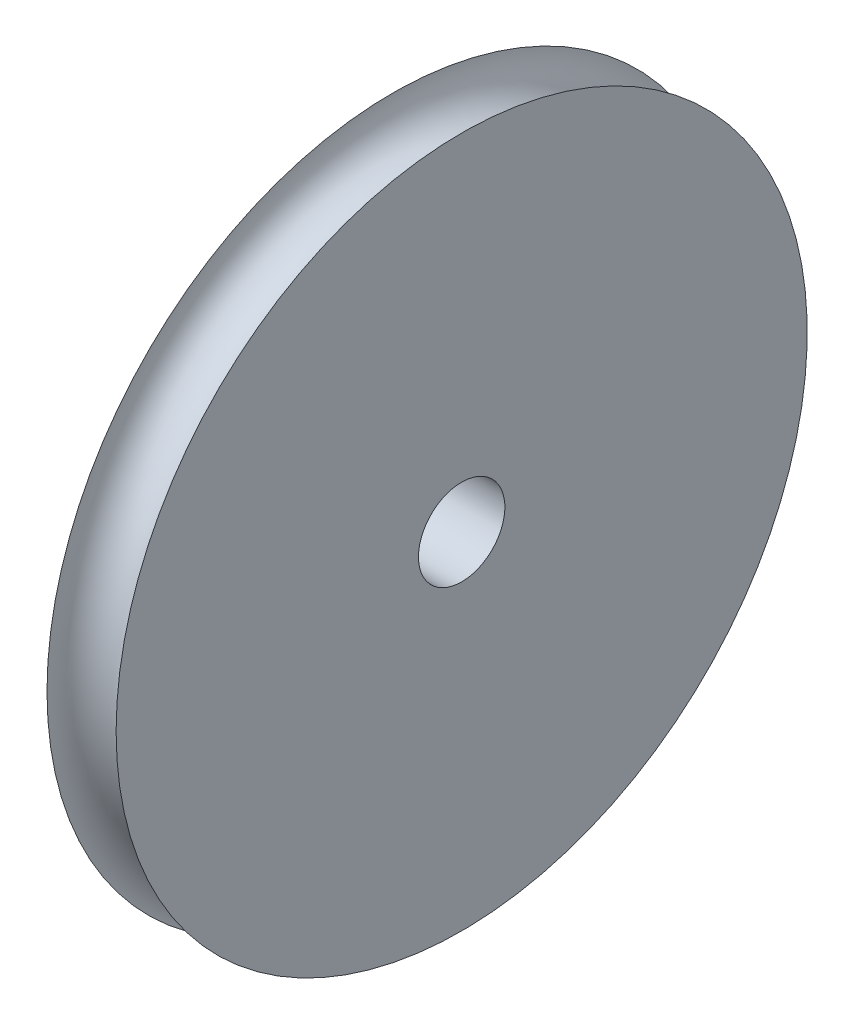
ISO-10303-21;
HEADER;
FILE_DESCRIPTION(('STEP AP214'),'2;1');
FILE_NAME('part.step','',(''),(''),'','','');
FILE_SCHEMA(('AUTOMOTIVE_DESIGN { 1 0 10303 214 1 1 1 1 }'));
ENDSEC;
DATA;
#1=APPLICATION_CONTEXT('core data for automotive mechanical design processes');
#2=APPLICATION_PROTOCOL_DEFINITION('international standard','automotive_design',2000,#1);
#3=PRODUCT_CONTEXT('',#1,'mechanical');
#4=PRODUCT('Part','Part','',(#3));
#5=PRODUCT_RELATED_PRODUCT_CATEGORY('part','',(#4));
#6=PRODUCT_DEFINITION_FORMATION('','',#4);
#7=PRODUCT_DEFINITION_CONTEXT('part definition',#1,'design');
#8=PRODUCT_DEFINITION('design','',#6,#7);
#9=PRODUCT_DEFINITION_SHAPE('','',#8);
#10=(LENGTH_UNIT() NAMED_UNIT(*) SI_UNIT(.MILLI.,.METRE.));
#11=(NAMED_UNIT(*) PLANE_ANGLE_UNIT() SI_UNIT($,.RADIAN.));
#12=(NAMED_UNIT(*) SI_UNIT($,.STERADIAN.) SOLID_ANGLE_UNIT());
#13=UNCERTAINTY_MEASURE_WITH_UNIT(LENGTH_MEASURE(1.E-05),#10,'distance_accuracy_value','');
#14=(GEOMETRIC_REPRESENTATION_CONTEXT(3) GLOBAL_UNCERTAINTY_ASSIGNED_CONTEXT((#13)) GLOBAL_UNIT_ASSIGNED_CONTEXT((#10,
#11,#12)) REPRESENTATION_CONTEXT('',''));
#15=CARTESIAN_POINT('',(0.,0.,0.));
#16=DIRECTION('',(0.,0.,1.));
#17=DIRECTION('',(1.,0.,0.));
#18=AXIS2_PLACEMENT_3D('',#15,#16,#17);
#19=CARTESIAN_POINT('',(-24.0415507401463,0.,0.));
#20=DIRECTION('',(-1.,0.,0.));
#21=DIRECTION('',(0.,0.,1.));
#22=AXIS2_PLACEMENT_3D('',#19,#20,#21);
#23=CYLINDRICAL_SURFACE('',#22,5.5);
#24=CARTESIAN_POINT('',(-2.35,0.,5.5));
#25=CARTESIAN_POINT('',(-2.35000226591321,-0.0692591392984518,5.49999873675926));
#26=CARTESIAN_POINT('',(-2.35577561378846,-0.138545086129003,5.49867854673065));
#27=CARTESIAN_POINT('',(-2.37868973803085,-0.275144297299661,5.493539660153));
#28=CARTESIAN_POINT('',(-2.39583819797764,-0.342456196110364,5.48971927481324));
#29=CARTESIAN_POINT('',(-2.44093402431595,-0.473113835992456,5.48000476561469));
#30=CARTESIAN_POINT('',(-2.46886966399037,-0.536463797478235,5.47411289428369));
#31=CARTESIAN_POINT('',(-2.53470855669044,-0.657576137912827,5.46088910081351));
#32=CARTESIAN_POINT('',(-2.57261171042121,-0.715338572515908,5.45355719301992));
#33=CARTESIAN_POINT('',(-2.65800102230334,-0.824633802223187,5.4381132908407));
#34=CARTESIAN_POINT('',(-2.70562628673751,-0.876056469460242,5.42999098791628));
#35=CARTESIAN_POINT('',(-2.80880948706863,-0.970256949083049,5.41395325591652));
#36=CARTESIAN_POINT('',(-2.86436817534723,-1.01303394060892,5.40603784654665));
#37=CARTESIAN_POINT('',(-2.98266602764185,-1.08922299700893,5.39120791846105));
#38=CARTESIAN_POINT('',(-3.04548349815292,-1.12251627178287,5.38430657902887));
#39=CARTESIAN_POINT('',(-3.17600475029081,-1.17803034858935,5.37243480737543));
#40=CARTESIAN_POINT('',(-3.24370789603081,-1.20025258858874,5.36746412440839));
#41=CARTESIAN_POINT('',(-3.38087959355827,-1.23262674706359,5.36012172349153));
#42=CARTESIAN_POINT('',(-3.45029963156127,-1.24297446340377,5.3577078986695));
#43=CARTESIAN_POINT('',(-3.58992911360655,-1.25191494225743,5.35562617033839));
#44=CARTESIAN_POINT('',(-3.66013845133114,-1.25050926943276,5.35595790132901));
#45=CARTESIAN_POINT('',(-3.79788644167435,-1.23614008479381,5.35929175179597));
#46=CARTESIAN_POINT('',(-3.86545045309746,-1.22340552299718,5.36224097064878));
#47=CARTESIAN_POINT('',(-3.99745724307741,-1.18710342460251,5.37039368363716));
#48=CARTESIAN_POINT('',(-4.06189983381359,-1.16353523702144,5.3755973132372));
#49=CARTESIAN_POINT('',(-4.18647033590527,-1.10602867201272,5.38772371922684));
#50=CARTESIAN_POINT('',(-4.24655675888184,-1.07200356043004,5.39466077989125));
#51=CARTESIAN_POINT('',(-4.36025127655553,-0.994609889602036,5.40946384216207));
#52=CARTESIAN_POINT('',(-4.41385842013197,-0.951239961185669,5.41732997981731));
#53=CARTESIAN_POINT('',(-4.51438928091051,-0.85518259001758,5.43333076436253));
#54=CARTESIAN_POINT('',(-4.56112721325818,-0.802300833714135,5.44146738675749));
#55=CARTESIAN_POINT('',(-4.64510294435355,-0.68935614920486,5.45692512985791));
#56=CARTESIAN_POINT('',(-4.68234054334973,-0.629293070045399,5.46424623341466));
#57=CARTESIAN_POINT('',(-4.74631019398575,-0.503453995899576,5.47727487123187));
#58=CARTESIAN_POINT('',(-4.77301638681116,-0.437664417174078,5.48297842424367));
#59=CARTESIAN_POINT('',(-4.81494200293396,-0.302372561245849,5.49209994783491));
#60=CARTESIAN_POINT('',(-4.83016323291109,-0.23287086983186,5.49551827788919));
#61=CARTESIAN_POINT('',(-4.84841311873634,-0.0937199200963669,5.4996325035878));
#62=CARTESIAN_POINT('',(-4.85169534565837,-0.0241055461685196,5.50038500920564));
#63=CARTESIAN_POINT('',(-4.84666348007353,0.114676943340051,5.49924211275316));
#64=CARTESIAN_POINT('',(-4.83835024029701,0.183845091360428,5.49734690539558));
#65=CARTESIAN_POINT('',(-4.81057341654729,0.318920838609228,5.49115740518707));
#66=CARTESIAN_POINT('',(-4.79124422677813,0.384857518407212,5.4868920435275));
#67=CARTESIAN_POINT('',(-4.74213448627146,0.512551965438801,5.47644030661836));
#68=CARTESIAN_POINT('',(-4.71235299787337,0.574309357161442,5.47025375902772));
#69=CARTESIAN_POINT('',(-4.64266542822233,0.692930426280278,5.45650716375474));
#70=CARTESIAN_POINT('',(-4.60261218661342,0.749705342613595,5.4489276492766));
#71=CARTESIAN_POINT('',(-4.5137103357799,0.855818867895258,5.43327304782299));
#72=CARTESIAN_POINT('',(-4.46486048672658,0.905156426789845,5.42519789109562));
#73=CARTESIAN_POINT('',(-4.35858451743329,0.996008531090476,5.40926438572433));
#74=CARTESIAN_POINT('',(-4.30100637910659,1.03734683297031,5.40141360596267));
#75=CARTESIAN_POINT('',(-4.17957680466486,1.10976907203276,5.3870011660802));
#76=CARTESIAN_POINT('',(-4.11572564602019,1.14085346250508,5.38043944897962));
#77=CARTESIAN_POINT('',(-3.98390976521554,1.19166798620963,5.36941374353368));
#78=CARTESIAN_POINT('',(-3.91597133812833,1.21146358110852,5.3649376890851));
#79=CARTESIAN_POINT('',(-3.77761654665044,1.23932629170182,5.35857055292907));
#80=CARTESIAN_POINT('',(-3.7072006174318,1.24739545670807,5.35667901955397));
#81=CARTESIAN_POINT('',(-3.56767069034455,1.25148369607082,5.35572514716112));
#82=CARTESIAN_POINT('',(-3.4985652003332,1.24778274250535,5.35659707290885));
#83=CARTESIAN_POINT('',(-3.36199054490587,1.22906557701641,5.36092234234569));
#84=CARTESIAN_POINT('',(-3.29452135694477,1.21404952108504,5.36437565044738));
#85=CARTESIAN_POINT('',(-3.16337830131686,1.17326846180304,5.37344130135241));
#86=CARTESIAN_POINT('',(-3.09969015442925,1.14754728763997,5.37904483343351));
#87=CARTESIAN_POINT('',(-2.9774926465497,1.0861226830344,5.39178236164052));
#88=CARTESIAN_POINT('',(-2.91898387483725,1.05041811865611,5.39891653159828));
#89=CARTESIAN_POINT('',(-2.80743278617237,0.969124984455243,5.41410553631702));
#90=CARTESIAN_POINT('',(-2.75453713889631,0.923338228214168,5.42217702793932));
#91=CARTESIAN_POINT('',(-2.65708840745903,0.823578144662085,5.43822274296525));
#92=CARTESIAN_POINT('',(-2.61253726451702,0.769602917703376,5.44619694333323));
#93=CARTESIAN_POINT('',(-2.53243096988315,0.65407030257528,5.46128466945207));
#94=CARTESIAN_POINT('',(-2.49701308833343,0.592415810938097,5.46838430808557));
#95=CARTESIAN_POINT('',(-2.43710001466853,0.463877983855843,5.48078202756997));
#96=CARTESIAN_POINT('',(-2.41259600260667,0.396998922168846,5.48608156233362));
#97=CARTESIAN_POINT('',(-2.37938604691194,0.27508153576981,5.49337797563918));
#98=CARTESIAN_POINT('',(-2.36838800615536,0.220684055569243,5.49584542792493));
#99=CARTESIAN_POINT('',(-2.35369426321033,0.110863407465458,5.49915690403688));
#100=CARTESIAN_POINT('',(-2.34999818619042,0.0554402923585501,5.50000101119414));
#101=CARTESIAN_POINT('',(-2.35,0.,5.5));
#102=B_SPLINE_CURVE_WITH_KNOTS('',3,(#24,#25,#26,#27,#28,#29,#30,#31,#32,#33,#34,#35,#36,#37,
#38,#39,#40,#41,#42,#43,#44,#45,#46,#47,#48,#49,#50,#51,#52,#53,#54,#55,#56,#57,#58,#59,#60,#61,
#62,#63,#64,#65,#66,#67,#68,#69,#70,#71,#72,#73,#74,#75,#76,#77,#78,#79,#80,#81,#82,#83,#84,#85,
#86,#87,#88,#89,#90,#91,#92,#93,#94,#95,#96,#97,#98,#99,#100,#101),.UNSPECIFIED.,.T.,.F.,(4,2,2,
2,2,2,2,2,2,2,2,2,2,2,2,2,2,2,2,2,2,2,2,2,2,2,2,2,2,2,2,2,2,2,2,2,2,2,4),(0.,0.207574424816657,
0.415289203498463,0.62277880877659,0.830266347152622,1.04096194698404,1.25167754182901,
1.46492681486707,1.67814838269119,1.8878012244904,2.09742615684378,2.30290857087117,
2.50840333376985,2.71565078719424,2.92292862648988,3.13505765901851,3.3471911513493,
3.55984232048323,3.77246003084946,3.9805347095838,4.18859408731812,4.39416788074517,
4.5997601206154,4.80848064664382,5.01723061362836,5.23015660770196,5.44307318779737,
5.65474220954493,5.86637423554697,6.07301021975725,6.27964335529766,6.48543868288071,
6.69125739465899,6.90155512892952,7.11190172510032,7.32524638726731,7.53841832261075,
7.70458523862177,7.87074362456999),.UNSPECIFIED.);
#103=CARTESIAN_POINT('',(-2.35,0.,5.5));
#104=VERTEX_POINT('',#103);
#105=EDGE_CURVE('E36',#104,#104,#102,.T.);
#106=ORIENTED_EDGE('',*,*,#105,.T.);
#107=EDGE_LOOP('',(#106));
#108=FACE_BOUND('',#107,.T.);
#109=CARTESIAN_POINT('',(-5.6,0.,0.));
#110=DIRECTION('',(-1.,0.,0.));
#111=DIRECTION('',(0.,0.,1.));
#112=AXIS2_PLACEMENT_3D('',#109,#110,#111);
#113=CIRCLE('',#112,5.5);
#114=CARTESIAN_POINT('',(-5.6,0.,5.5));
#115=VERTEX_POINT('',#114);
#116=EDGE_CURVE('E10',#115,#115,#113,.T.);
#117=ORIENTED_EDGE('',*,*,#116,.F.);
#118=EDGE_LOOP('',(#117));
#119=FACE_BOUND('',#118,.T.);
#120=CARTESIAN_POINT('',(-1.6,0.,0.));
#121=DIRECTION('',(-1.,0.,0.));
#122=DIRECTION('',(0.,0.,1.));
#123=AXIS2_PLACEMENT_3D('',#120,#121,#122);
#124=CIRCLE('',#123,5.5);
#125=CARTESIAN_POINT('',(-1.6,0.,5.5));
#126=VERTEX_POINT('',#125);
#127=EDGE_CURVE('E58',#126,#126,#124,.T.);
#128=ORIENTED_EDGE('',*,*,#127,.T.);
#129=EDGE_LOOP('',(#128));
#130=FACE_BOUND('',#129,.T.);
#131=ADVANCED_FACE('F32',(#108,#119,#130),#23,.T.);
#132=CARTESIAN_POINT('',(-5.6,2.,0.));
#133=DIRECTION('',(1.,0.,0.));
#134=DIRECTION('',(0.,0.,-1.));
#135=AXIS2_PLACEMENT_3D('',#132,#133,#134);
#136=PLANE('',#135);
#137=CARTESIAN_POINT('',(-5.6,0.,0.));
#138=DIRECTION('',(-1.,0.,0.));
#139=DIRECTION('',(0.,0.,1.));
#140=AXIS2_PLACEMENT_3D('',#137,#138,#139);
#141=CIRCLE('',#140,2.);
#142=CARTESIAN_POINT('',(-5.6,0.,2.));
#143=VERTEX_POINT('',#142);
#144=EDGE_CURVE('E43',#143,#143,#141,.T.);
#145=ORIENTED_EDGE('',*,*,#144,.F.);
#146=EDGE_LOOP('',(#145));
#147=FACE_BOUND('',#146,.T.);
#148=ORIENTED_EDGE('',*,*,#116,.T.);
#149=EDGE_LOOP('',(#148));
#150=FACE_BOUND('',#149,.T.);
#151=ADVANCED_FACE('F88',(#147,#150),#136,.F.);
#152=CARTESIAN_POINT('',(-24.0415507401463,0.,0.));
#153=DIRECTION('',(-1.,0.,0.));
#154=DIRECTION('',(0.,0.,1.));
#155=AXIS2_PLACEMENT_3D('',#152,#153,#154);
#156=CYLINDRICAL_SURFACE('',#155,2.);
#157=CARTESIAN_POINT('',(-2.35,0.,2.));
#158=CARTESIAN_POINT('',(-2.35000434999878,0.0635104730002025,1.99999595305313));
#159=CARTESIAN_POINT('',(-2.35487301181781,0.127096441053757,1.99694323311001));
#160=CARTESIAN_POINT('',(-2.37408580342951,0.252318262265281,1.98502167724102));
#161=CARTESIAN_POINT('',(-2.38844799392549,0.313950163299072,1.97614175574896));
#162=CARTESIAN_POINT('',(-2.42581136316206,0.433205558136782,1.95345852982134));
#163=CARTESIAN_POINT('',(-2.44876978784088,0.490847243665016,1.93967960778663));
#164=CARTESIAN_POINT('',(-2.50238585079676,0.601260368868359,1.90834598486073));
#165=CARTESIAN_POINT('',(-2.53304263600919,0.654032347276151,1.89079170235271));
#166=CARTESIAN_POINT('',(-2.60388657318498,0.757974192167972,1.85170152902273));
#167=CARTESIAN_POINT('',(-2.64463929997545,0.808679560769975,1.82995962224617));
#168=CARTESIAN_POINT('',(-2.73321917450656,0.902986375146757,1.78531349913632));
#169=CARTESIAN_POINT('',(-2.78105582825794,0.946578107215731,1.76240774858553));
#170=CARTESIAN_POINT('',(-2.89003389420452,1.03142873237132,1.71430418655199));
#171=CARTESIAN_POINT('',(-2.95209978660728,1.07157206029151,1.68921610993412));
#172=CARTESIAN_POINT('',(-3.08356481544719,1.14073966020039,1.64330198128731));
#173=CARTESIAN_POINT('',(-3.15295131257608,1.16978270899534,1.62246875996239));
#174=CARTESIAN_POINT('',(-3.27881052377872,1.2093340058598,1.59309575627364));
#175=CARTESIAN_POINT('',(-3.33396681853882,1.22269552371393,1.58276905990074));
#176=CARTESIAN_POINT('',(-3.4463059256108,1.24181843585479,1.56781357325806));
#177=CARTESIAN_POINT('',(-3.50348575827449,1.24759056342087,1.56317673673692));
#178=CARTESIAN_POINT('',(-3.61841301675112,1.25118918245719,1.56029885782827));
#179=CARTESIAN_POINT('',(-3.6761615364624,1.24899483727851,1.56207458771719));
#180=CARTESIAN_POINT('',(-3.79031010318896,1.23676317046804,1.5717740238392));
#181=CARTESIAN_POINT('',(-3.84670903203908,1.22671956265043,1.5797026576711));
#182=CARTESIAN_POINT('',(-3.95543845265748,1.19968103371474,1.60032573121781));
#183=CARTESIAN_POINT('',(-4.00783245568427,1.18285016736896,1.61290715104814));
#184=CARTESIAN_POINT('',(-4.10916118240542,1.14290189820937,1.64145566443406));
#185=CARTESIAN_POINT('',(-4.1580946748745,1.11978227193695,1.65742395501354));
#186=CARTESIAN_POINT('',(-4.26083327383274,1.06294892954949,1.6945481599302));
#187=CARTESIAN_POINT('',(-4.31384081012039,1.0280629660117,1.71611591575959));
#188=CARTESIAN_POINT('',(-4.41383027900048,0.950881463002099,1.76005711791243));
#189=CARTESIAN_POINT('',(-4.46080593170652,0.908578308011435,1.78243137335976));
#190=CARTESIAN_POINT('',(-4.55530174937039,0.809519713023329,1.82979894916857));
#191=CARTESIAN_POINT('',(-4.60163297425883,0.751531353595331,1.85461531676593));
#192=CARTESIAN_POINT('',(-4.68385089588724,0.627148099593568,1.90028055062445));
#193=CARTESIAN_POINT('',(-4.71974169772893,0.560756523881998,1.92113097514764));
#194=CARTESIAN_POINT('',(-4.77776368838142,0.424883562934748,1.95553372961316));
#195=CARTESIAN_POINT('',(-4.80053403998118,0.35576345773237,1.96941976591574));
#196=CARTESIAN_POINT('',(-4.83376492798281,0.213612154574976,1.98984929310048));
#197=CARTESIAN_POINT('',(-4.844242894222,0.140586648341304,1.9964031799007));
#198=CARTESIAN_POINT('',(-4.8515658500612,0.00451561874058876,2.00097840540091));
#199=CARTESIAN_POINT('',(-4.85020317795385,-0.0584027741637845,2.00012161345511));
#200=CARTESIAN_POINT('',(-4.83811717157927,-0.182972117996309,1.99258901494327));
#201=CARTESIAN_POINT('',(-4.82739447490783,-0.244623154962733,1.98591360473591));
#202=CARTESIAN_POINT('',(-4.79776146330804,-0.362521070658189,1.9677405228307));
#203=CARTESIAN_POINT('',(-4.77918784320335,-0.418885009953203,1.95644170526844));
#204=CARTESIAN_POINT('',(-4.73470361072143,-0.527638281070987,1.92995684104751));
#205=CARTESIAN_POINT('',(-4.70879176974484,-0.580026945470714,1.91477014350266));
#206=CARTESIAN_POINT('',(-4.64748479400452,-0.685084056277255,1.87990012356));
#207=CARTESIAN_POINT('',(-4.61139643076176,-0.737246967843402,1.85991764817225));
#208=CARTESIAN_POINT('',(-4.53220613484719,-0.835142640217339,1.81806970001717));
#209=CARTESIAN_POINT('',(-4.48909641074546,-0.880868151291852,1.79620214826384));
#210=CARTESIAN_POINT('',(-4.38986496058735,-0.971474198022881,1.74905869713091));
#211=CARTESIAN_POINT('',(-4.33276279370522,-1.01526851939752,1.72374883414957));
#212=CARTESIAN_POINT('',(-4.21112421505574,-1.09280351885684,1.67566762748172));
#213=CARTESIAN_POINT('',(-4.14659299324701,-1.12655115718693,1.65289453322336));
#214=CARTESIAN_POINT('',(-4.02530785194312,-1.17684772011828,1.61733530314592));
#215=CARTESIAN_POINT('',(-3.96975924926778,-1.19551895865479,1.6034563619378));
#216=CARTESIAN_POINT('',(-3.85560685423108,-1.22500108205245,1.58105030663767));
#217=CARTESIAN_POINT('',(-3.79700799054854,-1.23582424983127,1.57251483242606));
#218=CARTESIAN_POINT('',(-3.67790972311931,-1.24901383653654,1.56206324988732));
#219=CARTESIAN_POINT('',(-3.61740141451183,-1.25133186963292,1.56018501674569));
#220=CARTESIAN_POINT('',(-3.49686903963396,-1.24719778716817,1.56349063109848));
#221=CARTESIAN_POINT('',(-3.43684514099049,-1.24074275650142,1.56867682595586));
#222=CARTESIAN_POINT('',(-3.32397020494864,-1.22038272403399,1.58455388771334));
#223=CARTESIAN_POINT('',(-3.27093069858359,-1.2071191949977,1.5947680805106));
#224=CARTESIAN_POINT('',(-3.16786494041409,-1.17417623469513,1.61917530435691));
#225=CARTESIAN_POINT('',(-3.1178399554625,-1.15449412799406,1.63336999423728));
#226=CARTESIAN_POINT('',(-3.0144032561273,-1.10602690439618,1.66663902886518));
#227=CARTESIAN_POINT('',(-2.96154970152345,-1.0763364445546,1.68612230498997));
#228=CARTESIAN_POINT('',(-2.861061632754,-1.01000017036389,1.72667706411868));
#229=CARTESIAN_POINT('',(-2.81343138743952,-0.97334873286694,1.74774982276825));
#230=CARTESIAN_POINT('',(-2.71498574502216,-0.885670221416059,1.79401910731182));
#231=CARTESIAN_POINT('',(-2.66540915455452,-0.833233674246794,1.81920541808776));
#232=CARTESIAN_POINT('',(-2.57550517029476,-0.719822446025203,1.86698729056748));
#233=CARTESIAN_POINT('',(-2.5351835040726,-0.658842515138549,1.88958124364395));
#234=CARTESIAN_POINT('',(-2.4652288698759,-0.529355399891407,1.92986710976548));
#235=CARTESIAN_POINT('',(-2.43561399459416,-0.460835727056569,1.94755071355356));
#236=CARTESIAN_POINT('',(-2.38892811566826,-0.318394712729499,1.97581521637842));
#237=CARTESIAN_POINT('',(-2.37181276513022,-0.244493501106849,1.98642121428689));
#238=CARTESIAN_POINT('',(-2.35770079083737,-0.141418481224663,1.99519472168143));
#239=CARTESIAN_POINT('',(-2.35481813466603,-0.113248608862869,1.99699172226301));
#240=CARTESIAN_POINT('',(-2.3509667084624,-0.0567241864870896,1.9993953021324));
#241=CARTESIAN_POINT('',(-2.34999805689001,-0.0283696251514527,2.00000180773911));
#242=CARTESIAN_POINT('',(-2.35,0.,2.));
#243=B_SPLINE_CURVE_WITH_KNOTS('',3,(#157,#158,#159,#160,#161,#162,#163,#164,#165,#166,#167,
#168,#169,#170,#171,#172,#173,#174,#175,#176,#177,#178,#179,#180,#181,#182,#183,#184,#185,#186,
#187,#188,#189,#190,#191,#192,#193,#194,#195,#196,#197,#198,#199,#200,#201,#202,#203,#204,#205,
#206,#207,#208,#209,#210,#211,#212,#213,#214,#215,#216,#217,#218,#219,#220,#221,#222,#223,#224,
#225,#226,#227,#228,#229,#230,#231,#232,#233,#234,#235,#236,#237,#238,#239,#240,#241,#242),
.UNSPECIFIED.,.T.,.F.,(4,2,2,2,2,2,2,2,2,2,2,2,2,2,2,2,2,2,2,2,2,2,2,2,2,2,2,2,2,2,2,2,2,2,2,2,
2,2,2,2,2,2,4),(0.,0.190412301434132,0.381187894128461,0.571026987595135,0.760845054038794,
0.965821870536216,1.17107628325701,1.40412975852973,1.6367872460701,1.80912008879717,
1.9812089470739,2.15374823498778,2.32642584505083,2.49515839460436,2.66395067908032,
2.86427450354359,3.06480522575181,3.29842180699521,3.5319464072786,3.75284174135958,
3.9734234795813,4.16127180597572,4.3491073373228,4.52959504531297,4.71011298928465,
4.90885230990551,5.10781368827685,5.33565708863712,5.56334227196909,5.74329940313719,
5.92297427413351,6.10366974688199,6.28442527563863,6.45063169037739,6.61690747313441,
6.80725523036977,6.99775741153768,7.2260053903511,7.45439424578498,7.68316725607076,
7.91112460944406,7.99617501232479,8.08123067890587),.UNSPECIFIED.);
#244=CARTESIAN_POINT('',(-2.35,0.,2.));
#245=VERTEX_POINT('',#244);
#246=EDGE_CURVE('E61',#245,#245,#243,.T.);
#247=ORIENTED_EDGE('',*,*,#246,.T.);
#248=EDGE_LOOP('',(#247));
#249=FACE_BOUND('',#248,.T.);
#250=CARTESIAN_POINT('',(1.6,0.,0.));
#251=DIRECTION('',(-1.,0.,0.));
#252=DIRECTION('',(0.,0.,1.));
#253=AXIS2_PLACEMENT_3D('',#250,#251,#252);
#254=CIRCLE('',#253,2.);
#255=CARTESIAN_POINT('',(1.6,0.,2.));
#256=VERTEX_POINT('',#255);
#257=EDGE_CURVE('E47',#256,#256,#254,.T.);
#258=ORIENTED_EDGE('',*,*,#257,.F.);
#259=EDGE_LOOP('',(#258));
#260=FACE_BOUND('',#259,.T.);
#261=ORIENTED_EDGE('',*,*,#144,.T.);
#262=EDGE_LOOP('',(#261));
#263=FACE_BOUND('',#262,.T.);
#264=ADVANCED_FACE('F66',(#249,#260,#263),#156,.F.);
#265=CARTESIAN_POINT('',(1.6,16.,0.));
#266=DIRECTION('',(-1.,0.,0.));
#267=DIRECTION('',(0.,0.,1.));
#268=AXIS2_PLACEMENT_3D('',#265,#266,#267);
#269=PLANE('',#268);
#270=CARTESIAN_POINT('',(1.6,0.,0.));
#271=DIRECTION('',(-1.,0.,0.));
#272=DIRECTION('',(0.,0.,1.));
#273=AXIS2_PLACEMENT_3D('',#270,#271,#272);
#274=CIRCLE('',#273,16.);
#275=CARTESIAN_POINT('',(1.6,0.,16.));
#276=VERTEX_POINT('',#275);
#277=EDGE_CURVE('E52',#276,#276,#274,.T.);
#278=ORIENTED_EDGE('',*,*,#277,.F.);
#279=EDGE_LOOP('',(#278));
#280=FACE_BOUND('',#279,.T.);
#281=ORIENTED_EDGE('',*,*,#257,.T.);
#282=EDGE_LOOP('',(#281));
#283=FACE_BOUND('',#282,.T.);
#284=ADVANCED_FACE('F81',(#280,#283),#269,.F.);
#285=CARTESIAN_POINT('',(0.,0.,0.));
#286=DIRECTION('',(-1.,0.,0.));
#287=DIRECTION('',(0.,0.,1.));
#288=AXIS2_PLACEMENT_3D('',#285,#286,#287);
#289=TOROIDAL_SURFACE('',#288,16.,1.6);
#290=CARTESIAN_POINT('',(-1.6,0.,0.));
#291=DIRECTION('',(-1.,0.,0.));
#292=DIRECTION('',(0.,0.,1.));
#293=AXIS2_PLACEMENT_3D('',#290,#291,#292);
#294=CIRCLE('',#293,16.);
#295=CARTESIAN_POINT('',(-1.6,0.,16.));
#296=VERTEX_POINT('',#295);
#297=EDGE_CURVE('E55',#296,#296,#294,.T.);
#298=ORIENTED_EDGE('',*,*,#297,.F.);
#299=EDGE_LOOP('',(#298));
#300=FACE_BOUND('',#299,.T.);
#301=ORIENTED_EDGE('',*,*,#277,.T.);
#302=EDGE_LOOP('',(#301));
#303=FACE_BOUND('',#302,.T.);
#304=ADVANCED_FACE('F78',(#300,#303),#289,.F.);
#305=CARTESIAN_POINT('',(-1.6,5.5,0.));
#306=DIRECTION('',(1.,0.,0.));
#307=DIRECTION('',(0.,0.,-1.));
#308=AXIS2_PLACEMENT_3D('',#305,#306,#307);
#309=PLANE('',#308);
#310=ORIENTED_EDGE('',*,*,#127,.F.);
#311=EDGE_LOOP('',(#310));
#312=FACE_BOUND('',#311,.T.);
#313=ORIENTED_EDGE('',*,*,#297,.T.);
#314=EDGE_LOOP('',(#313));
#315=FACE_BOUND('',#314,.T.);
#316=ADVANCED_FACE('F73',(#312,#315),#309,.F.);
#317=CARTESIAN_POINT('',(-3.6,0.,0.));
#318=DIRECTION('',(0.,0.,-1.));
#319=DIRECTION('',(-1.,0.,0.));
#320=AXIS2_PLACEMENT_3D('',#317,#318,#319);
#321=CYLINDRICAL_SURFACE('',#320,1.25);
#322=ORIENTED_EDGE('',*,*,#105,.F.);
#323=EDGE_LOOP('',(#322));
#324=FACE_BOUND('',#323,.T.);
#325=ORIENTED_EDGE('',*,*,#246,.F.);
#326=EDGE_LOOP('',(#325));
#327=FACE_BOUND('',#326,.T.);
#328=ADVANCED_FACE('F69',(#324,#327),#321,.F.);
#329=CLOSED_SHELL('',(#131,#151,#264,#284,#304,#316,#328));
#330=MANIFOLD_SOLID_BREP('B2',#329);
#331=ADVANCED_BREP_SHAPE_REPRESENTATION('',(#18,#330),#14);
#332=SHAPE_DEFINITION_REPRESENTATION(#9,#331);
ENDSEC;
END-ISO-10303-21;
